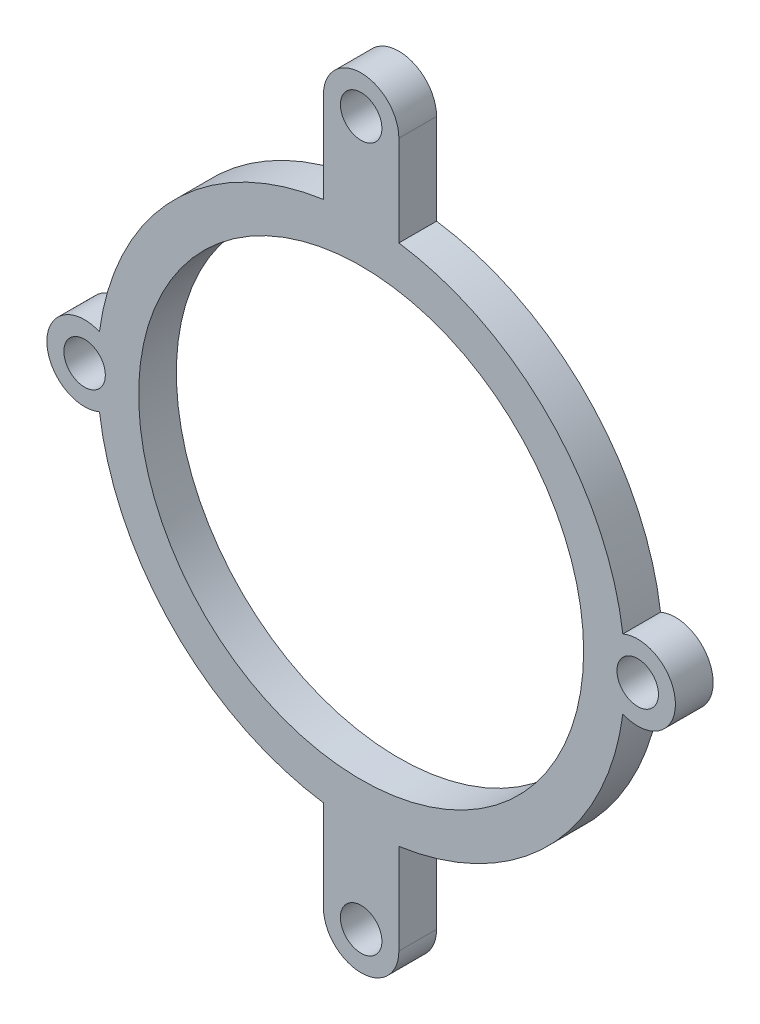
ISO-10303-21;
HEADER;
FILE_DESCRIPTION(('STEP AP214'),'2;1');
FILE_NAME('part.step','',(''),(''),'','','');
FILE_SCHEMA(('AUTOMOTIVE_DESIGN { 1 0 10303 214 1 1 1 1 }'));
ENDSEC;
DATA;
#1=APPLICATION_CONTEXT('core data for automotive mechanical design processes');
#2=APPLICATION_PROTOCOL_DEFINITION('international standard','automotive_design',2000,#1);
#3=PRODUCT_CONTEXT('',#1,'mechanical');
#4=PRODUCT('Part','Part','',(#3));
#5=PRODUCT_RELATED_PRODUCT_CATEGORY('part','',(#4));
#6=PRODUCT_DEFINITION_FORMATION('','',#4);
#7=PRODUCT_DEFINITION_CONTEXT('part definition',#1,'design');
#8=PRODUCT_DEFINITION('design','',#6,#7);
#9=PRODUCT_DEFINITION_SHAPE('','',#8);
#10=(LENGTH_UNIT() NAMED_UNIT(*) SI_UNIT(.MILLI.,.METRE.));
#11=(NAMED_UNIT(*) PLANE_ANGLE_UNIT() SI_UNIT($,.RADIAN.));
#12=(NAMED_UNIT(*) SI_UNIT($,.STERADIAN.) SOLID_ANGLE_UNIT());
#13=UNCERTAINTY_MEASURE_WITH_UNIT(LENGTH_MEASURE(1.E-05),#10,'distance_accuracy_value','');
#14=(GEOMETRIC_REPRESENTATION_CONTEXT(3) GLOBAL_UNCERTAINTY_ASSIGNED_CONTEXT((#13)) GLOBAL_UNIT_ASSIGNED_CONTEXT((#10,
#11,#12)) REPRESENTATION_CONTEXT('',''));
#15=CARTESIAN_POINT('',(0.,0.,0.));
#16=DIRECTION('',(0.,0.,1.));
#17=DIRECTION('',(1.,0.,0.));
#18=AXIS2_PLACEMENT_3D('',#15,#16,#17);
#19=CARTESIAN_POINT('',(-22.,0.,3.));
#20=DIRECTION('',(0.,0.,-1.));
#21=DIRECTION('',(-1.,0.,0.));
#22=AXIS2_PLACEMENT_3D('',#19,#20,#21);
#23=CYLINDRICAL_SURFACE('',#22,3.);
#24=CARTESIAN_POINT('',(-22.,0.,0.));
#25=DIRECTION('',(0.,0.,1.));
#26=DIRECTION('',(1.,0.,0.));
#27=AXIS2_PLACEMENT_3D('',#24,#25,#26);
#28=CIRCLE('',#27,3.);
#29=CARTESIAN_POINT('',(-20.8181818181818,2.75740925238238,0.));
#30=VERTEX_POINT('',#29);
#31=CARTESIAN_POINT('',(-20.8181818181818,-2.75740925238238,0.));
#32=VERTEX_POINT('',#31);
#33=EDGE_CURVE('E173',#30,#32,#28,.T.);
#34=ORIENTED_EDGE('',*,*,#33,.T.);
#35=DIRECTION('',(0.,0.,-1.));
#36=VECTOR('',#35,1.);
#37=CARTESIAN_POINT('',(-20.8181818181818,-2.75740925238238,3.));
#38=LINE('',#37,#36);
#39=CARTESIAN_POINT('',(-20.8181818181818,-2.75740925238238,3.));
#40=VERTEX_POINT('',#39);
#41=EDGE_CURVE('E11',#40,#32,#38,.T.);
#42=ORIENTED_EDGE('',*,*,#41,.F.);
#43=CARTESIAN_POINT('',(-22.,0.,3.));
#44=DIRECTION('',(0.,0.,1.));
#45=DIRECTION('',(1.,0.,0.));
#46=AXIS2_PLACEMENT_3D('',#43,#44,#45);
#47=CIRCLE('',#46,3.);
#48=CARTESIAN_POINT('',(-20.8181818181818,2.75740925238238,3.));
#49=VERTEX_POINT('',#48);
#50=EDGE_CURVE('E209',#49,#40,#47,.T.);
#51=ORIENTED_EDGE('',*,*,#50,.F.);
#52=DIRECTION('',(0.,0.,-1.));
#53=VECTOR('',#52,1.);
#54=CARTESIAN_POINT('',(-20.8181818181818,2.75740925238238,3.));
#55=LINE('',#54,#53);
#56=EDGE_CURVE('E172',#49,#30,#55,.T.);
#57=ORIENTED_EDGE('',*,*,#56,.T.);
#58=EDGE_LOOP('',(#34,#42,#51,#57));
#59=FACE_BOUND('',#58,.T.);
#60=ADVANCED_FACE('F37',(#59),#23,.T.);
#61=CARTESIAN_POINT('',(0.,0.,3.));
#62=DIRECTION('',(0.,0.,-1.));
#63=DIRECTION('',(-1.,0.,0.));
#64=AXIS2_PLACEMENT_3D('',#61,#62,#63);
#65=CYLINDRICAL_SURFACE('',#64,21.);
#66=CARTESIAN_POINT('',(0.,0.,0.));
#67=DIRECTION('',(0.,0.,1.));
#68=DIRECTION('',(1.,0.,0.));
#69=AXIS2_PLACEMENT_3D('',#66,#67,#68);
#70=CIRCLE('',#69,21.);
#71=CARTESIAN_POINT('',(-3.,-20.7846096908265,0.));
#72=VERTEX_POINT('',#71);
#73=EDGE_CURVE('E176',#32,#72,#70,.T.);
#74=ORIENTED_EDGE('',*,*,#73,.T.);
#75=DIRECTION('',(0.,0.,-1.));
#76=VECTOR('',#75,1.);
#77=CARTESIAN_POINT('',(-3.,-20.7846096908265,3.));
#78=LINE('',#77,#76);
#79=CARTESIAN_POINT('',(-3.,-20.7846096908265,3.));
#80=VERTEX_POINT('',#79);
#81=EDGE_CURVE('E45',#80,#72,#78,.T.);
#82=ORIENTED_EDGE('',*,*,#81,.F.);
#83=CARTESIAN_POINT('',(0.,0.,3.));
#84=DIRECTION('',(0.,0.,1.));
#85=DIRECTION('',(1.,0.,0.));
#86=AXIS2_PLACEMENT_3D('',#83,#84,#85);
#87=CIRCLE('',#86,21.);
#88=EDGE_CURVE('E108',#40,#80,#87,.T.);
#89=ORIENTED_EDGE('',*,*,#88,.F.);
#90=ORIENTED_EDGE('',*,*,#41,.T.);
#91=EDGE_LOOP('',(#74,#82,#89,#90));
#92=FACE_BOUND('',#91,.T.);
#93=ADVANCED_FACE('F292',(#92),#65,.T.);
#94=CARTESIAN_POINT('',(-3.,0.,3.));
#95=DIRECTION('',(1.,0.,0.));
#96=DIRECTION('',(0.,0.,-1.));
#97=AXIS2_PLACEMENT_3D('',#94,#95,#96);
#98=PLANE('',#97);
#99=DIRECTION('',(0.,-1.,0.));
#100=VECTOR('',#99,1.);
#101=CARTESIAN_POINT('',(-3.,0.,0.));
#102=LINE('',#101,#100);
#103=CARTESIAN_POINT('',(-3.,-28.,0.));
#104=VERTEX_POINT('',#103);
#105=EDGE_CURVE('E178',#72,#104,#102,.T.);
#106=ORIENTED_EDGE('',*,*,#105,.T.);
#107=DIRECTION('',(0.,0.,-1.));
#108=VECTOR('',#107,1.);
#109=CARTESIAN_POINT('',(-3.,-28.,3.));
#110=LINE('',#109,#108);
#111=CARTESIAN_POINT('',(-3.,-28.,3.));
#112=VERTEX_POINT('',#111);
#113=EDGE_CURVE('E228',#112,#104,#110,.T.);
#114=ORIENTED_EDGE('',*,*,#113,.F.);
#115=DIRECTION('',(0.,-1.,0.));
#116=VECTOR('',#115,1.);
#117=CARTESIAN_POINT('',(-3.,0.,3.));
#118=LINE('',#117,#116);
#119=EDGE_CURVE('E236',#80,#112,#118,.T.);
#120=ORIENTED_EDGE('',*,*,#119,.F.);
#121=ORIENTED_EDGE('',*,*,#81,.T.);
#122=EDGE_LOOP('',(#106,#114,#120,#121));
#123=FACE_BOUND('',#122,.T.);
#124=ADVANCED_FACE('F234',(#123),#98,.F.);
#125=CARTESIAN_POINT('',(0.,-28.,3.));
#126=DIRECTION('',(0.,0.,-1.));
#127=DIRECTION('',(-1.,0.,0.));
#128=AXIS2_PLACEMENT_3D('',#125,#126,#127);
#129=CYLINDRICAL_SURFACE('',#128,3.);
#130=CARTESIAN_POINT('',(0.,-28.,0.));
#131=DIRECTION('',(0.,0.,1.));
#132=DIRECTION('',(1.,0.,0.));
#133=AXIS2_PLACEMENT_3D('',#130,#131,#132);
#134=CIRCLE('',#133,3.);
#135=CARTESIAN_POINT('',(3.,-28.,0.));
#136=VERTEX_POINT('',#135);
#137=EDGE_CURVE('E180',#104,#136,#134,.T.);
#138=ORIENTED_EDGE('',*,*,#137,.T.);
#139=DIRECTION('',(0.,0.,-1.));
#140=VECTOR('',#139,1.);
#141=CARTESIAN_POINT('',(3.,-28.,3.));
#142=LINE('',#141,#140);
#143=CARTESIAN_POINT('',(3.,-28.,3.));
#144=VERTEX_POINT('',#143);
#145=EDGE_CURVE('E225',#144,#136,#142,.T.);
#146=ORIENTED_EDGE('',*,*,#145,.F.);
#147=CARTESIAN_POINT('',(0.,-28.,3.));
#148=DIRECTION('',(0.,0.,1.));
#149=DIRECTION('',(1.,0.,0.));
#150=AXIS2_PLACEMENT_3D('',#147,#148,#149);
#151=CIRCLE('',#150,3.);
#152=EDGE_CURVE('E255',#112,#144,#151,.T.);
#153=ORIENTED_EDGE('',*,*,#152,.F.);
#154=ORIENTED_EDGE('',*,*,#113,.T.);
#155=EDGE_LOOP('',(#138,#146,#153,#154));
#156=FACE_BOUND('',#155,.T.);
#157=ADVANCED_FACE('F246',(#156),#129,.T.);
#158=CARTESIAN_POINT('',(3.,0.,3.));
#159=DIRECTION('',(-1.,0.,0.));
#160=DIRECTION('',(0.,0.,1.));
#161=AXIS2_PLACEMENT_3D('',#158,#159,#160);
#162=PLANE('',#161);
#163=DIRECTION('',(0.,1.,0.));
#164=VECTOR('',#163,1.);
#165=CARTESIAN_POINT('',(3.,0.,0.));
#166=LINE('',#165,#164);
#167=CARTESIAN_POINT('',(3.,-20.7846096908265,0.));
#168=VERTEX_POINT('',#167);
#169=EDGE_CURVE('E182',#136,#168,#166,.T.);
#170=ORIENTED_EDGE('',*,*,#169,.T.);
#171=DIRECTION('',(0.,0.,-1.));
#172=VECTOR('',#171,1.);
#173=CARTESIAN_POINT('',(3.,-20.7846096908265,3.));
#174=LINE('',#173,#172);
#175=CARTESIAN_POINT('',(3.,-20.7846096908265,3.));
#176=VERTEX_POINT('',#175);
#177=EDGE_CURVE('E222',#176,#168,#174,.T.);
#178=ORIENTED_EDGE('',*,*,#177,.F.);
#179=DIRECTION('',(0.,1.,0.));
#180=VECTOR('',#179,1.);
#181=CARTESIAN_POINT('',(3.,0.,3.));
#182=LINE('',#181,#180);
#183=EDGE_CURVE('E252',#144,#176,#182,.T.);
#184=ORIENTED_EDGE('',*,*,#183,.F.);
#185=ORIENTED_EDGE('',*,*,#145,.T.);
#186=EDGE_LOOP('',(#170,#178,#184,#185));
#187=FACE_BOUND('',#186,.T.);
#188=ADVANCED_FACE('F250',(#187),#162,.F.);
#189=CARTESIAN_POINT('',(0.,0.,3.));
#190=DIRECTION('',(0.,0.,-1.));
#191=DIRECTION('',(-1.,0.,0.));
#192=AXIS2_PLACEMENT_3D('',#189,#190,#191);
#193=CYLINDRICAL_SURFACE('',#192,21.);
#194=CARTESIAN_POINT('',(0.,0.,0.));
#195=DIRECTION('',(0.,0.,1.));
#196=DIRECTION('',(1.,0.,0.));
#197=AXIS2_PLACEMENT_3D('',#194,#195,#196);
#198=CIRCLE('',#197,21.);
#199=CARTESIAN_POINT('',(20.8181818181818,-2.75740925238238,0.));
#200=VERTEX_POINT('',#199);
#201=EDGE_CURVE('E184',#168,#200,#198,.T.);
#202=ORIENTED_EDGE('',*,*,#201,.T.);
#203=DIRECTION('',(0.,0.,-1.));
#204=VECTOR('',#203,1.);
#205=CARTESIAN_POINT('',(20.8181818181818,-2.75740925238238,3.));
#206=LINE('',#205,#204);
#207=CARTESIAN_POINT('',(20.8181818181818,-2.75740925238238,3.));
#208=VERTEX_POINT('',#207);
#209=EDGE_CURVE('E219',#208,#200,#206,.T.);
#210=ORIENTED_EDGE('',*,*,#209,.F.);
#211=CARTESIAN_POINT('',(0.,0.,3.));
#212=DIRECTION('',(0.,0.,1.));
#213=DIRECTION('',(1.,0.,0.));
#214=AXIS2_PLACEMENT_3D('',#211,#212,#213);
#215=CIRCLE('',#214,21.);
#216=EDGE_CURVE('E254',#176,#208,#215,.T.);
#217=ORIENTED_EDGE('',*,*,#216,.F.);
#218=ORIENTED_EDGE('',*,*,#177,.T.);
#219=EDGE_LOOP('',(#202,#210,#217,#218));
#220=FACE_BOUND('',#219,.T.);
#221=ADVANCED_FACE('F305',(#220),#193,.T.);
#222=CARTESIAN_POINT('',(22.,0.,3.));
#223=DIRECTION('',(0.,0.,-1.));
#224=DIRECTION('',(-1.,0.,0.));
#225=AXIS2_PLACEMENT_3D('',#222,#223,#224);
#226=CYLINDRICAL_SURFACE('',#225,3.);
#227=CARTESIAN_POINT('',(22.,0.,0.));
#228=DIRECTION('',(0.,0.,1.));
#229=DIRECTION('',(1.,0.,0.));
#230=AXIS2_PLACEMENT_3D('',#227,#228,#229);
#231=CIRCLE('',#230,3.);
#232=CARTESIAN_POINT('',(20.8181818181818,2.75740925238238,0.));
#233=VERTEX_POINT('',#232);
#234=EDGE_CURVE('E186',#200,#233,#231,.T.);
#235=ORIENTED_EDGE('',*,*,#234,.T.);
#236=DIRECTION('',(0.,0.,-1.));
#237=VECTOR('',#236,1.);
#238=CARTESIAN_POINT('',(20.8181818181818,2.75740925238238,3.));
#239=LINE('',#238,#237);
#240=CARTESIAN_POINT('',(20.8181818181818,2.75740925238238,3.));
#241=VERTEX_POINT('',#240);
#242=EDGE_CURVE('E216',#241,#233,#239,.T.);
#243=ORIENTED_EDGE('',*,*,#242,.F.);
#244=CARTESIAN_POINT('',(22.,0.,3.));
#245=DIRECTION('',(0.,0.,1.));
#246=DIRECTION('',(1.,0.,0.));
#247=AXIS2_PLACEMENT_3D('',#244,#245,#246);
#248=CIRCLE('',#247,3.);
#249=EDGE_CURVE('E257',#208,#241,#248,.T.);
#250=ORIENTED_EDGE('',*,*,#249,.F.);
#251=ORIENTED_EDGE('',*,*,#209,.T.);
#252=EDGE_LOOP('',(#235,#243,#250,#251));
#253=FACE_BOUND('',#252,.T.);
#254=ADVANCED_FACE('F306',(#253),#226,.T.);
#255=CARTESIAN_POINT('',(3.,20.7846096908265,0.));
#256=VERTEX_POINT('',#255);
#257=EDGE_CURVE('E187',#233,#256,#198,.T.);
#258=ORIENTED_EDGE('',*,*,#257,.T.);
#259=DIRECTION('',(0.,0.,-1.));
#260=VECTOR('',#259,1.);
#261=CARTESIAN_POINT('',(3.,20.7846096908265,3.));
#262=LINE('',#261,#260);
#263=CARTESIAN_POINT('',(3.,20.7846096908265,3.));
#264=VERTEX_POINT('',#263);
#265=EDGE_CURVE('E213',#264,#256,#262,.T.);
#266=ORIENTED_EDGE('',*,*,#265,.F.);
#267=EDGE_CURVE('E259',#241,#264,#215,.T.);
#268=ORIENTED_EDGE('',*,*,#267,.F.);
#269=ORIENTED_EDGE('',*,*,#242,.T.);
#270=EDGE_LOOP('',(#258,#266,#268,#269));
#271=FACE_BOUND('',#270,.T.);
#272=ADVANCED_FACE('F268',(#271),#193,.T.);
#273=CARTESIAN_POINT('',(3.,0.,3.));
#274=DIRECTION('',(-1.,0.,0.));
#275=DIRECTION('',(0.,0.,1.));
#276=AXIS2_PLACEMENT_3D('',#273,#274,#275);
#277=PLANE('',#276);
#278=DIRECTION('',(0.,1.,0.));
#279=VECTOR('',#278,1.);
#280=CARTESIAN_POINT('',(3.,0.,0.));
#281=LINE('',#280,#279);
#282=CARTESIAN_POINT('',(3.,28.,0.));
#283=VERTEX_POINT('',#282);
#284=EDGE_CURVE('E189',#256,#283,#281,.T.);
#285=ORIENTED_EDGE('',*,*,#284,.T.);
#286=DIRECTION('',(0.,0.,-1.));
#287=VECTOR('',#286,1.);
#288=CARTESIAN_POINT('',(3.,28.,3.));
#289=LINE('',#288,#287);
#290=CARTESIAN_POINT('',(3.,28.,3.));
#291=VERTEX_POINT('',#290);
#292=EDGE_CURVE('E149',#291,#283,#289,.T.);
#293=ORIENTED_EDGE('',*,*,#292,.F.);
#294=DIRECTION('',(0.,1.,0.));
#295=VECTOR('',#294,1.);
#296=CARTESIAN_POINT('',(3.,0.,3.));
#297=LINE('',#296,#295);
#298=EDGE_CURVE('E140',#264,#291,#297,.T.);
#299=ORIENTED_EDGE('',*,*,#298,.F.);
#300=ORIENTED_EDGE('',*,*,#265,.T.);
#301=EDGE_LOOP('',(#285,#293,#299,#300));
#302=FACE_BOUND('',#301,.T.);
#303=ADVANCED_FACE('F272',(#302),#277,.F.);
#304=CARTESIAN_POINT('',(0.,28.,3.));
#305=DIRECTION('',(0.,0.,-1.));
#306=DIRECTION('',(-1.,0.,0.));
#307=AXIS2_PLACEMENT_3D('',#304,#305,#306);
#308=CYLINDRICAL_SURFACE('',#307,3.);
#309=CARTESIAN_POINT('',(0.,28.,0.));
#310=DIRECTION('',(0.,0.,1.));
#311=DIRECTION('',(1.,0.,0.));
#312=AXIS2_PLACEMENT_3D('',#309,#310,#311);
#313=CIRCLE('',#312,3.);
#314=CARTESIAN_POINT('',(-3.,28.,0.));
#315=VERTEX_POINT('',#314);
#316=EDGE_CURVE('E148',#283,#315,#313,.T.);
#317=ORIENTED_EDGE('',*,*,#316,.T.);
#318=DIRECTION('',(0.,0.,-1.));
#319=VECTOR('',#318,1.);
#320=CARTESIAN_POINT('',(-3.,28.,3.));
#321=LINE('',#320,#319);
#322=CARTESIAN_POINT('',(-3.,28.,3.));
#323=VERTEX_POINT('',#322);
#324=EDGE_CURVE('E145',#323,#315,#321,.T.);
#325=ORIENTED_EDGE('',*,*,#324,.F.);
#326=CARTESIAN_POINT('',(0.,28.,3.));
#327=DIRECTION('',(0.,0.,1.));
#328=DIRECTION('',(1.,0.,0.));
#329=AXIS2_PLACEMENT_3D('',#326,#327,#328);
#330=CIRCLE('',#329,3.);
#331=EDGE_CURVE('E133',#291,#323,#330,.T.);
#332=ORIENTED_EDGE('',*,*,#331,.F.);
#333=ORIENTED_EDGE('',*,*,#292,.T.);
#334=EDGE_LOOP('',(#317,#325,#332,#333));
#335=FACE_BOUND('',#334,.T.);
#336=ADVANCED_FACE('F146',(#335),#308,.T.);
#337=CARTESIAN_POINT('',(-3.,0.,3.));
#338=DIRECTION('',(1.,0.,0.));
#339=DIRECTION('',(0.,0.,-1.));
#340=AXIS2_PLACEMENT_3D('',#337,#338,#339);
#341=PLANE('',#340);
#342=DIRECTION('',(0.,-1.,0.));
#343=VECTOR('',#342,1.);
#344=CARTESIAN_POINT('',(-3.,0.,0.));
#345=LINE('',#344,#343);
#346=CARTESIAN_POINT('',(-3.,20.7846096908265,0.));
#347=VERTEX_POINT('',#346);
#348=EDGE_CURVE('E94',#315,#347,#345,.T.);
#349=ORIENTED_EDGE('',*,*,#348,.T.);
#350=DIRECTION('',(0.,0.,-1.));
#351=VECTOR('',#350,1.);
#352=CARTESIAN_POINT('',(-3.,20.7846096908265,3.));
#353=LINE('',#352,#351);
#354=CARTESIAN_POINT('',(-3.,20.7846096908265,3.));
#355=VERTEX_POINT('',#354);
#356=EDGE_CURVE('E150',#355,#347,#353,.T.);
#357=ORIENTED_EDGE('',*,*,#356,.F.);
#358=DIRECTION('',(0.,-1.,0.));
#359=VECTOR('',#358,1.);
#360=CARTESIAN_POINT('',(-3.,0.,3.));
#361=LINE('',#360,#359);
#362=EDGE_CURVE('E138',#323,#355,#361,.T.);
#363=ORIENTED_EDGE('',*,*,#362,.F.);
#364=ORIENTED_EDGE('',*,*,#324,.T.);
#365=EDGE_LOOP('',(#349,#357,#363,#364));
#366=FACE_BOUND('',#365,.T.);
#367=ADVANCED_FACE('F152',(#366),#341,.F.);
#368=CARTESIAN_POINT('',(0.,-28.,3.));
#369=DIRECTION('',(0.,0.,-1.));
#370=DIRECTION('',(-1.,0.,0.));
#371=AXIS2_PLACEMENT_3D('',#368,#369,#370);
#372=CYLINDRICAL_SURFACE('',#371,1.65);
#373=CARTESIAN_POINT('',(0.,-28.,3.));
#374=DIRECTION('',(0.,0.,1.));
#375=DIRECTION('',(1.,0.,0.));
#376=AXIS2_PLACEMENT_3D('',#373,#374,#375);
#377=CIRCLE('',#376,1.65);
#378=CARTESIAN_POINT('',(1.65,-28.,3.));
#379=VERTEX_POINT('',#378);
#380=EDGE_CURVE('E166',#379,#379,#377,.T.);
#381=ORIENTED_EDGE('',*,*,#380,.T.);
#382=EDGE_LOOP('',(#381));
#383=FACE_BOUND('',#382,.T.);
#384=CARTESIAN_POINT('',(0.,-28.,0.));
#385=DIRECTION('',(0.,0.,1.));
#386=DIRECTION('',(1.,0.,0.));
#387=AXIS2_PLACEMENT_3D('',#384,#385,#386);
#388=CIRCLE('',#387,1.65);
#389=CARTESIAN_POINT('',(1.65,-28.,0.));
#390=VERTEX_POINT('',#389);
#391=EDGE_CURVE('E203',#390,#390,#388,.T.);
#392=ORIENTED_EDGE('',*,*,#391,.F.);
#393=EDGE_LOOP('',(#392));
#394=FACE_BOUND('',#393,.T.);
#395=ADVANCED_FACE('F316',(#383,#394),#372,.F.);
#396=CARTESIAN_POINT('',(22.,0.,3.));
#397=DIRECTION('',(0.,0.,-1.));
#398=DIRECTION('',(-1.,0.,0.));
#399=AXIS2_PLACEMENT_3D('',#396,#397,#398);
#400=CYLINDRICAL_SURFACE('',#399,1.65);
#401=CARTESIAN_POINT('',(22.,0.,3.));
#402=DIRECTION('',(0.,0.,1.));
#403=DIRECTION('',(1.,0.,0.));
#404=AXIS2_PLACEMENT_3D('',#401,#402,#403);
#405=CIRCLE('',#404,1.65);
#406=CARTESIAN_POINT('',(23.65,0.,3.));
#407=VERTEX_POINT('',#406);
#408=EDGE_CURVE('E163',#407,#407,#405,.T.);
#409=ORIENTED_EDGE('',*,*,#408,.T.);
#410=EDGE_LOOP('',(#409));
#411=FACE_BOUND('',#410,.T.);
#412=CARTESIAN_POINT('',(22.,0.,0.));
#413=DIRECTION('',(0.,0.,1.));
#414=DIRECTION('',(1.,0.,0.));
#415=AXIS2_PLACEMENT_3D('',#412,#413,#414);
#416=CIRCLE('',#415,1.65);
#417=CARTESIAN_POINT('',(23.65,0.,0.));
#418=VERTEX_POINT('',#417);
#419=EDGE_CURVE('E200',#418,#418,#416,.T.);
#420=ORIENTED_EDGE('',*,*,#419,.F.);
#421=EDGE_LOOP('',(#420));
#422=FACE_BOUND('',#421,.T.);
#423=ADVANCED_FACE('F320',(#411,#422),#400,.F.);
#424=CARTESIAN_POINT('',(0.,0.,3.));
#425=DIRECTION('',(0.,0.,-1.));
#426=DIRECTION('',(-1.,0.,0.));
#427=AXIS2_PLACEMENT_3D('',#424,#425,#426);
#428=CYLINDRICAL_SURFACE('',#427,17.7);
#429=CARTESIAN_POINT('',(0.,0.,3.));
#430=DIRECTION('',(0.,0.,1.));
#431=DIRECTION('',(1.,0.,0.));
#432=AXIS2_PLACEMENT_3D('',#429,#430,#431);
#433=CIRCLE('',#432,17.7);
#434=CARTESIAN_POINT('',(17.7,0.,3.));
#435=VERTEX_POINT('',#434);
#436=EDGE_CURVE('E160',#435,#435,#433,.T.);
#437=ORIENTED_EDGE('',*,*,#436,.T.);
#438=EDGE_LOOP('',(#437));
#439=FACE_BOUND('',#438,.T.);
#440=CARTESIAN_POINT('',(0.,0.,0.));
#441=DIRECTION('',(0.,0.,1.));
#442=DIRECTION('',(1.,0.,0.));
#443=AXIS2_PLACEMENT_3D('',#440,#441,#442);
#444=CIRCLE('',#443,17.7);
#445=CARTESIAN_POINT('',(17.7,0.,0.));
#446=VERTEX_POINT('',#445);
#447=EDGE_CURVE('E197',#446,#446,#444,.T.);
#448=ORIENTED_EDGE('',*,*,#447,.F.);
#449=EDGE_LOOP('',(#448));
#450=FACE_BOUND('',#449,.T.);
#451=ADVANCED_FACE('F287',(#439,#450),#428,.F.);
#452=CARTESIAN_POINT('',(-22.,0.,3.));
#453=DIRECTION('',(0.,0.,-1.));
#454=DIRECTION('',(-1.,0.,0.));
#455=AXIS2_PLACEMENT_3D('',#452,#453,#454);
#456=CYLINDRICAL_SURFACE('',#455,1.65);
#457=CARTESIAN_POINT('',(-22.,0.,3.));
#458=DIRECTION('',(0.,0.,1.));
#459=DIRECTION('',(1.,0.,0.));
#460=AXIS2_PLACEMENT_3D('',#457,#458,#459);
#461=CIRCLE('',#460,1.65);
#462=CARTESIAN_POINT('',(-20.35,0.,3.));
#463=VERTEX_POINT('',#462);
#464=EDGE_CURVE('E154',#463,#463,#461,.T.);
#465=ORIENTED_EDGE('',*,*,#464,.T.);
#466=EDGE_LOOP('',(#465));
#467=FACE_BOUND('',#466,.T.);
#468=CARTESIAN_POINT('',(-22.,0.,0.));
#469=DIRECTION('',(0.,0.,1.));
#470=DIRECTION('',(1.,0.,0.));
#471=AXIS2_PLACEMENT_3D('',#468,#469,#470);
#472=CIRCLE('',#471,1.65);
#473=CARTESIAN_POINT('',(-20.35,0.,0.));
#474=VERTEX_POINT('',#473);
#475=EDGE_CURVE('E194',#474,#474,#472,.T.);
#476=ORIENTED_EDGE('',*,*,#475,.F.);
#477=EDGE_LOOP('',(#476));
#478=FACE_BOUND('',#477,.T.);
#479=ADVANCED_FACE('F279',(#467,#478),#456,.F.);
#480=CARTESIAN_POINT('',(0.,0.,3.));
#481=DIRECTION('',(0.,0.,-1.));
#482=DIRECTION('',(-1.,0.,0.));
#483=AXIS2_PLACEMENT_3D('',#480,#481,#482);
#484=CYLINDRICAL_SURFACE('',#483,21.);
#485=CARTESIAN_POINT('',(0.,0.,0.));
#486=DIRECTION('',(0.,0.,1.));
#487=DIRECTION('',(1.,0.,0.));
#488=AXIS2_PLACEMENT_3D('',#485,#486,#487);
#489=CIRCLE('',#488,21.);
#490=EDGE_CURVE('E100',#347,#30,#489,.T.);
#491=ORIENTED_EDGE('',*,*,#490,.T.);
#492=ORIENTED_EDGE('',*,*,#56,.F.);
#493=CARTESIAN_POINT('',(0.,0.,3.));
#494=DIRECTION('',(0.,0.,1.));
#495=DIRECTION('',(1.,0.,0.));
#496=AXIS2_PLACEMENT_3D('',#493,#494,#495);
#497=CIRCLE('',#496,21.);
#498=EDGE_CURVE('E53',#355,#49,#497,.T.);
#499=ORIENTED_EDGE('',*,*,#498,.F.);
#500=ORIENTED_EDGE('',*,*,#356,.T.);
#501=EDGE_LOOP('',(#491,#492,#499,#500));
#502=FACE_BOUND('',#501,.T.);
#503=ADVANCED_FACE('F276',(#502),#484,.T.);
#504=CARTESIAN_POINT('',(0.,28.,3.));
#505=DIRECTION('',(0.,0.,-1.));
#506=DIRECTION('',(-1.,0.,0.));
#507=AXIS2_PLACEMENT_3D('',#504,#505,#506);
#508=CYLINDRICAL_SURFACE('',#507,1.65);
#509=CARTESIAN_POINT('',(0.,28.,3.));
#510=DIRECTION('',(0.,0.,1.));
#511=DIRECTION('',(1.,0.,0.));
#512=AXIS2_PLACEMENT_3D('',#509,#510,#511);
#513=CIRCLE('',#512,1.65);
#514=CARTESIAN_POINT('',(1.65,28.,3.));
#515=VERTEX_POINT('',#514);
#516=EDGE_CURVE('E169',#515,#515,#513,.T.);
#517=ORIENTED_EDGE('',*,*,#516,.T.);
#518=EDGE_LOOP('',(#517));
#519=FACE_BOUND('',#518,.T.);
#520=CARTESIAN_POINT('',(0.,28.,0.));
#521=DIRECTION('',(0.,0.,1.));
#522=DIRECTION('',(1.,0.,0.));
#523=AXIS2_PLACEMENT_3D('',#520,#521,#522);
#524=CIRCLE('',#523,1.65);
#525=CARTESIAN_POINT('',(1.65,28.,0.));
#526=VERTEX_POINT('',#525);
#527=EDGE_CURVE('E206',#526,#526,#524,.T.);
#528=ORIENTED_EDGE('',*,*,#527,.F.);
#529=EDGE_LOOP('',(#528));
#530=FACE_BOUND('',#529,.T.);
#531=ADVANCED_FACE('F278',(#519,#530),#508,.F.);
#532=CARTESIAN_POINT('',(0.,0.,3.));
#533=DIRECTION('',(0.,0.,1.));
#534=DIRECTION('',(1.,0.,0.));
#535=AXIS2_PLACEMENT_3D('',#532,#533,#534);
#536=PLANE('',#535);
#537=ORIENTED_EDGE('',*,*,#50,.T.);
#538=ORIENTED_EDGE('',*,*,#88,.T.);
#539=ORIENTED_EDGE('',*,*,#119,.T.);
#540=ORIENTED_EDGE('',*,*,#152,.T.);
#541=ORIENTED_EDGE('',*,*,#183,.T.);
#542=ORIENTED_EDGE('',*,*,#216,.T.);
#543=ORIENTED_EDGE('',*,*,#249,.T.);
#544=ORIENTED_EDGE('',*,*,#267,.T.);
#545=ORIENTED_EDGE('',*,*,#298,.T.);
#546=ORIENTED_EDGE('',*,*,#331,.T.);
#547=ORIENTED_EDGE('',*,*,#362,.T.);
#548=ORIENTED_EDGE('',*,*,#498,.T.);
#549=EDGE_LOOP('',(#537,#538,#539,#540,#541,#542,#543,#544,#545,#546,#547,#548));
#550=FACE_BOUND('',#549,.T.);
#551=ORIENTED_EDGE('',*,*,#464,.F.);
#552=EDGE_LOOP('',(#551));
#553=FACE_BOUND('',#552,.T.);
#554=ORIENTED_EDGE('',*,*,#436,.F.);
#555=EDGE_LOOP('',(#554));
#556=FACE_BOUND('',#555,.T.);
#557=ORIENTED_EDGE('',*,*,#408,.F.);
#558=EDGE_LOOP('',(#557));
#559=FACE_BOUND('',#558,.T.);
#560=ORIENTED_EDGE('',*,*,#380,.F.);
#561=EDGE_LOOP('',(#560));
#562=FACE_BOUND('',#561,.T.);
#563=ORIENTED_EDGE('',*,*,#516,.F.);
#564=EDGE_LOOP('',(#563));
#565=FACE_BOUND('',#564,.T.);
#566=ADVANCED_FACE('F135',(#550,#553,#556,#559,#562,#565),#536,.T.);
#567=CARTESIAN_POINT('',(0.,0.,0.));
#568=DIRECTION('',(0.,0.,1.));
#569=DIRECTION('',(1.,0.,0.));
#570=AXIS2_PLACEMENT_3D('',#567,#568,#569);
#571=PLANE('',#570);
#572=ORIENTED_EDGE('',*,*,#33,.F.);
#573=ORIENTED_EDGE('',*,*,#490,.F.);
#574=ORIENTED_EDGE('',*,*,#348,.F.);
#575=ORIENTED_EDGE('',*,*,#316,.F.);
#576=ORIENTED_EDGE('',*,*,#284,.F.);
#577=ORIENTED_EDGE('',*,*,#257,.F.);
#578=ORIENTED_EDGE('',*,*,#234,.F.);
#579=ORIENTED_EDGE('',*,*,#201,.F.);
#580=ORIENTED_EDGE('',*,*,#169,.F.);
#581=ORIENTED_EDGE('',*,*,#137,.F.);
#582=ORIENTED_EDGE('',*,*,#105,.F.);
#583=ORIENTED_EDGE('',*,*,#73,.F.);
#584=EDGE_LOOP('',(#572,#573,#574,#575,#576,#577,#578,#579,#580,#581,#582,#583));
#585=FACE_BOUND('',#584,.T.);
#586=ORIENTED_EDGE('',*,*,#475,.T.);
#587=EDGE_LOOP('',(#586));
#588=FACE_BOUND('',#587,.T.);
#589=ORIENTED_EDGE('',*,*,#447,.T.);
#590=EDGE_LOOP('',(#589));
#591=FACE_BOUND('',#590,.T.);
#592=ORIENTED_EDGE('',*,*,#419,.T.);
#593=EDGE_LOOP('',(#592));
#594=FACE_BOUND('',#593,.T.);
#595=ORIENTED_EDGE('',*,*,#391,.T.);
#596=EDGE_LOOP('',(#595));
#597=FACE_BOUND('',#596,.T.);
#598=ORIENTED_EDGE('',*,*,#527,.T.);
#599=EDGE_LOOP('',(#598));
#600=FACE_BOUND('',#599,.T.);
#601=ADVANCED_FACE('F240',(#585,#588,#591,#594,#597,#600),#571,.F.);
#602=CLOSED_SHELL('',(#60,#93,#124,#157,#188,#221,#254,#272,#303,#336,#367,#395,#423,#451,#479,
#503,#531,#566,#601));
#603=MANIFOLD_SOLID_BREP('B2',#602);
#604=ADVANCED_BREP_SHAPE_REPRESENTATION('',(#18,#603),#14);
#605=SHAPE_DEFINITION_REPRESENTATION(#9,#604);
ENDSEC;
END-ISO-10303-21;
